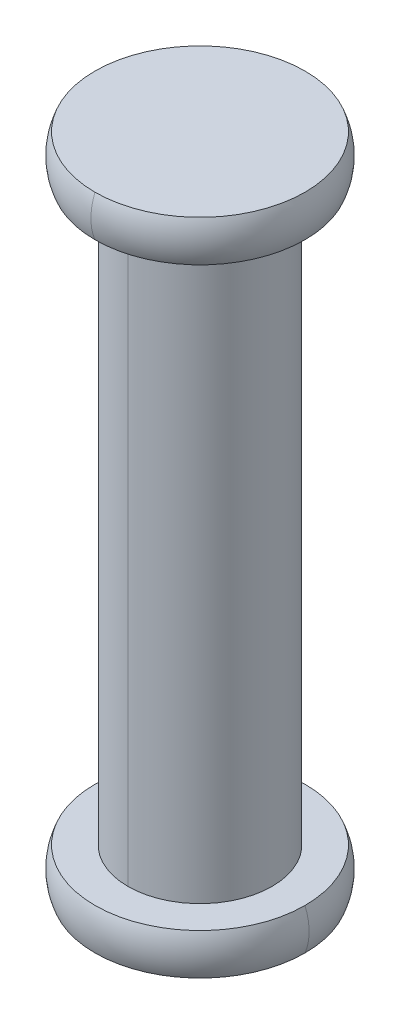
ISO-10303-21;
HEADER;
FILE_DESCRIPTION(('STEP AP214'),'2;1');
FILE_NAME('part.step','',(''),(''),'','','');
FILE_SCHEMA(('AUTOMOTIVE_DESIGN { 1 0 10303 214 1 1 1 1 }'));
ENDSEC;
DATA;
#1=APPLICATION_CONTEXT('core data for automotive mechanical design processes');
#2=APPLICATION_PROTOCOL_DEFINITION('international standard','automotive_design',2000,#1);
#3=PRODUCT_CONTEXT('',#1,'mechanical');
#4=PRODUCT('Part','Part','',(#3));
#5=PRODUCT_RELATED_PRODUCT_CATEGORY('part','',(#4));
#6=PRODUCT_DEFINITION_FORMATION('','',#4);
#7=PRODUCT_DEFINITION_CONTEXT('part definition',#1,'design');
#8=PRODUCT_DEFINITION('design','',#6,#7);
#9=PRODUCT_DEFINITION_SHAPE('','',#8);
#10=(LENGTH_UNIT() NAMED_UNIT(*) SI_UNIT(.MILLI.,.METRE.));
#11=(NAMED_UNIT(*) PLANE_ANGLE_UNIT() SI_UNIT($,.RADIAN.));
#12=(NAMED_UNIT(*) SI_UNIT($,.STERADIAN.) SOLID_ANGLE_UNIT());
#13=UNCERTAINTY_MEASURE_WITH_UNIT(LENGTH_MEASURE(1.E-05),#10,'distance_accuracy_value','');
#14=(GEOMETRIC_REPRESENTATION_CONTEXT(3) GLOBAL_UNCERTAINTY_ASSIGNED_CONTEXT((#13)) GLOBAL_UNIT_ASSIGNED_CONTEXT((#10,
#11,#12)) REPRESENTATION_CONTEXT('',''));
#15=CARTESIAN_POINT('',(0.,0.,0.));
#16=DIRECTION('',(0.,0.,1.));
#17=DIRECTION('',(1.,0.,0.));
#18=AXIS2_PLACEMENT_3D('',#15,#16,#17);
#19=CARTESIAN_POINT('',(29.1000000000009,-15.8473895582304,-32.0000000000058));
#20=DIRECTION('',(0.,1.,0.));
#21=DIRECTION('',(1.,0.,0.));
#22=AXIS2_PLACEMENT_3D('',#19,#20,#21);
#23=PLANE('',#22);
#24=CARTESIAN_POINT('',(24.0000000000009,-15.8473895582304,-32.0000000000058));
#25=DIRECTION('',(0.,1.,0.));
#26=DIRECTION('',(-1.,0.,0.));
#27=AXIS2_PLACEMENT_3D('',#24,#25,#26);
#28=CIRCLE('',#27,5.1);
#29=CARTESIAN_POINT('',(18.9000000000009,-15.8473895582304,-32.0000000000058));
#30=VERTEX_POINT('',#29);
#31=CARTESIAN_POINT('',(29.1000000000009,-15.8473895582304,-32.0000000000058));
#32=VERTEX_POINT('',#31);
#33=EDGE_CURVE('E163',#30,#32,#28,.T.);
#34=ORIENTED_EDGE('',*,*,#33,.F.);
#35=CARTESIAN_POINT('',(24.0000000000009,-15.8473895582304,-32.0000000000058));
#36=DIRECTION('',(0.,1.,0.));
#37=DIRECTION('',(-1.,0.,0.));
#38=AXIS2_PLACEMENT_3D('',#35,#36,#37);
#39=CIRCLE('',#38,5.1);
#40=EDGE_CURVE('E11',#32,#30,#39,.T.);
#41=ORIENTED_EDGE('',*,*,#40,.F.);
#42=EDGE_LOOP('',(#34,#41));
#43=FACE_BOUND('',#42,.T.);
#44=ADVANCED_FACE('F16',(#43),#23,.F.);
#45=CARTESIAN_POINT('',(29.1000000000009,16.1526104417696,-32.0000000000058));
#46=DIRECTION('',(0.,-1.,0.));
#47=DIRECTION('',(0.,0.,-1.));
#48=AXIS2_PLACEMENT_3D('',#45,#46,#47);
#49=PLANE('',#48);
#50=CARTESIAN_POINT('',(24.0000000000009,16.1526104417696,-32.0000000000058));
#51=DIRECTION('',(0.,-1.,0.));
#52=DIRECTION('',(0.,0.,1.));
#53=AXIS2_PLACEMENT_3D('',#50,#51,#52);
#54=CIRCLE('',#53,5.1);
#55=CARTESIAN_POINT('',(24.0000000000009,16.1526104417696,-26.9000000000058));
#56=VERTEX_POINT('',#55);
#57=CARTESIAN_POINT('',(24.0000000000009,16.1526104417696,-37.1000000000058));
#58=VERTEX_POINT('',#57);
#59=EDGE_CURVE('E25',#56,#58,#54,.T.);
#60=ORIENTED_EDGE('',*,*,#59,.F.);
#61=CARTESIAN_POINT('',(24.0000000000009,16.1526104417696,-32.0000000000058));
#62=DIRECTION('',(0.,-1.,0.));
#63=DIRECTION('',(0.,0.,1.));
#64=AXIS2_PLACEMENT_3D('',#61,#62,#63);
#65=CIRCLE('',#64,5.1);
#66=EDGE_CURVE('E139',#58,#56,#65,.T.);
#67=ORIENTED_EDGE('',*,*,#66,.F.);
#68=EDGE_LOOP('',(#60,#67));
#69=FACE_BOUND('',#68,.T.);
#70=ADVANCED_FACE('F302',(#69),#49,.F.);
#71=CARTESIAN_POINT('',(24.0000000000009,-14.8473895582304,-32.0000000000058));
#72=DIRECTION('',(0.,1.,0.));
#73=DIRECTION('',(-1.,0.,0.));
#74=AXIS2_PLACEMENT_3D('',#71,#72,#73);
#75=TOROIDAL_SURFACE('',#74,2.7,2.6);
#76=CARTESIAN_POINT('',(26.700000000001,-14.8473895582304,-32.0000000000058));
#77=DIRECTION('',(0.,0.,1.));
#78=DIRECTION('',(1.,0.,0.));
#79=AXIS2_PLACEMENT_3D('',#76,#77,#78);
#80=CIRCLE('',#79,2.6);
#81=CARTESIAN_POINT('',(29.1000000000009,-13.8473895582304,-32.0000000000058));
#82=VERTEX_POINT('',#81);
#83=EDGE_CURVE('E150',#32,#82,#80,.T.);
#84=ORIENTED_EDGE('',*,*,#83,.F.);
#85=ORIENTED_EDGE('',*,*,#40,.T.);
#86=CARTESIAN_POINT('',(21.3000000000009,-14.8473895582304,-32.0000000000058));
#87=DIRECTION('',(0.,0.,-1.));
#88=DIRECTION('',(0.,1.,0.));
#89=AXIS2_PLACEMENT_3D('',#86,#87,#88);
#90=CIRCLE('',#89,2.6);
#91=CARTESIAN_POINT('',(18.9000000000009,-13.8473895582304,-32.0000000000058));
#92=VERTEX_POINT('',#91);
#93=EDGE_CURVE('E117',#30,#92,#90,.T.);
#94=ORIENTED_EDGE('',*,*,#93,.T.);
#95=CARTESIAN_POINT('',(24.0000000000009,-13.8473895582304,-32.0000000000058));
#96=DIRECTION('',(0.,-1.,0.));
#97=DIRECTION('',(-1.,0.,0.));
#98=AXIS2_PLACEMENT_3D('',#95,#96,#97);
#99=CIRCLE('',#98,5.1);
#100=EDGE_CURVE('E38',#92,#82,#99,.T.);
#101=ORIENTED_EDGE('',*,*,#100,.T.);
#102=EDGE_LOOP('',(#84,#85,#94,#101));
#103=FACE_BOUND('',#102,.T.);
#104=ADVANCED_FACE('F285',(#103),#75,.T.);
#105=CARTESIAN_POINT('',(24.0000000000009,15.1526104417696,-32.0000000000058));
#106=DIRECTION('',(0.,1.,0.));
#107=DIRECTION('',(0.,0.,1.));
#108=AXIS2_PLACEMENT_3D('',#105,#106,#107);
#109=TOROIDAL_SURFACE('',#108,2.7,2.6);
#110=CARTESIAN_POINT('',(24.0000000000009,15.1526104417696,-34.7000000000058));
#111=DIRECTION('',(1.,0.,0.));
#112=DIRECTION('',(0.,0.,-1.));
#113=AXIS2_PLACEMENT_3D('',#110,#111,#112);
#114=CIRCLE('',#113,2.6);
#115=CARTESIAN_POINT('',(24.0000000000009,14.1526104417696,-37.1000000000058));
#116=VERTEX_POINT('',#115);
#117=EDGE_CURVE('E135',#116,#58,#114,.T.);
#118=ORIENTED_EDGE('',*,*,#117,.F.);
#119=CARTESIAN_POINT('',(24.0000000000009,14.1526104417696,-32.0000000000058));
#120=DIRECTION('',(0.,1.,0.));
#121=DIRECTION('',(0.,0.,1.));
#122=AXIS2_PLACEMENT_3D('',#119,#120,#121);
#123=CIRCLE('',#122,5.1);
#124=CARTESIAN_POINT('',(24.0000000000009,14.1526104417696,-26.9000000000058));
#125=VERTEX_POINT('',#124);
#126=EDGE_CURVE('E90',#116,#125,#123,.T.);
#127=ORIENTED_EDGE('',*,*,#126,.T.);
#128=CARTESIAN_POINT('',(24.0000000000009,15.1526104417696,-29.3000000000058));
#129=DIRECTION('',(-1.,0.,0.));
#130=DIRECTION('',(0.,0.,1.));
#131=AXIS2_PLACEMENT_3D('',#128,#129,#130);
#132=CIRCLE('',#131,2.6);
#133=EDGE_CURVE('E159',#125,#56,#132,.T.);
#134=ORIENTED_EDGE('',*,*,#133,.T.);
#135=ORIENTED_EDGE('',*,*,#59,.T.);
#136=EDGE_LOOP('',(#118,#127,#134,#135));
#137=FACE_BOUND('',#136,.T.);
#138=ADVANCED_FACE('F281',(#137),#109,.T.);
#139=CARTESIAN_POINT('',(27.5000000000009,-13.8473895582304,-32.0000000000058));
#140=DIRECTION('',(0.,-1.,0.));
#141=DIRECTION('',(0.,0.,-1.));
#142=AXIS2_PLACEMENT_3D('',#139,#140,#141);
#143=PLANE('',#142);
#144=CARTESIAN_POINT('',(24.0000000000009,-13.8473895582304,-32.0000000000058));
#145=DIRECTION('',(0.,1.,0.));
#146=DIRECTION('',(0.,0.,1.));
#147=AXIS2_PLACEMENT_3D('',#144,#145,#146);
#148=CIRCLE('',#147,3.5);
#149=CARTESIAN_POINT('',(24.0000000000009,-13.8473895582304,-28.5000000000058));
#150=VERTEX_POINT('',#149);
#151=CARTESIAN_POINT('',(24.0000000000009,-13.8473895582304,-35.5000000000058));
#152=VERTEX_POINT('',#151);
#153=EDGE_CURVE('E115',#150,#152,#148,.T.);
#154=ORIENTED_EDGE('',*,*,#153,.F.);
#155=CARTESIAN_POINT('',(24.0000000000009,-13.8473895582304,-32.0000000000058));
#156=DIRECTION('',(0.,1.,0.));
#157=DIRECTION('',(0.,0.,1.));
#158=AXIS2_PLACEMENT_3D('',#155,#156,#157);
#159=CIRCLE('',#158,3.5);
#160=EDGE_CURVE('E107',#152,#150,#159,.T.);
#161=ORIENTED_EDGE('',*,*,#160,.F.);
#162=EDGE_LOOP('',(#154,#161));
#163=FACE_BOUND('',#162,.T.);
#164=ORIENTED_EDGE('',*,*,#100,.F.);
#165=CARTESIAN_POINT('',(24.0000000000009,-13.8473895582304,-32.0000000000058));
#166=DIRECTION('',(0.,-1.,0.));
#167=DIRECTION('',(-1.,0.,0.));
#168=AXIS2_PLACEMENT_3D('',#165,#166,#167);
#169=CIRCLE('',#168,5.1);
#170=EDGE_CURVE('E145',#82,#92,#169,.T.);
#171=ORIENTED_EDGE('',*,*,#170,.F.);
#172=EDGE_LOOP('',(#164,#171));
#173=FACE_BOUND('',#172,.T.);
#174=ADVANCED_FACE('F113',(#163,#173),#143,.F.);
#175=CARTESIAN_POINT('',(27.5000000000009,14.1526104417696,-32.0000000000058));
#176=DIRECTION('',(0.,1.,0.));
#177=DIRECTION('',(1.,0.,0.));
#178=AXIS2_PLACEMENT_3D('',#175,#176,#177);
#179=PLANE('',#178);
#180=CARTESIAN_POINT('',(24.0000000000009,14.1526104417696,-32.0000000000058));
#181=DIRECTION('',(0.,-1.,0.));
#182=DIRECTION('',(0.,0.,1.));
#183=AXIS2_PLACEMENT_3D('',#180,#181,#182);
#184=CIRCLE('',#183,3.5);
#185=CARTESIAN_POINT('',(24.0000000000009,14.1526104417696,-28.5000000000058));
#186=VERTEX_POINT('',#185);
#187=CARTESIAN_POINT('',(24.0000000000009,14.1526104417696,-35.5000000000058));
#188=VERTEX_POINT('',#187);
#189=EDGE_CURVE('E82',#186,#188,#184,.T.);
#190=ORIENTED_EDGE('',*,*,#189,.F.);
#191=CARTESIAN_POINT('',(24.0000000000009,14.1526104417696,-32.0000000000058));
#192=DIRECTION('',(0.,-1.,0.));
#193=DIRECTION('',(0.,0.,1.));
#194=AXIS2_PLACEMENT_3D('',#191,#192,#193);
#195=CIRCLE('',#194,3.5);
#196=EDGE_CURVE('E125',#188,#186,#195,.T.);
#197=ORIENTED_EDGE('',*,*,#196,.F.);
#198=EDGE_LOOP('',(#190,#197));
#199=FACE_BOUND('',#198,.T.);
#200=CARTESIAN_POINT('',(24.0000000000009,14.1526104417696,-32.0000000000058));
#201=DIRECTION('',(0.,1.,0.));
#202=DIRECTION('',(0.,0.,1.));
#203=AXIS2_PLACEMENT_3D('',#200,#201,#202);
#204=CIRCLE('',#203,5.1);
#205=EDGE_CURVE('E140',#125,#116,#204,.T.);
#206=ORIENTED_EDGE('',*,*,#205,.F.);
#207=ORIENTED_EDGE('',*,*,#126,.F.);
#208=EDGE_LOOP('',(#206,#207));
#209=FACE_BOUND('',#208,.T.);
#210=ADVANCED_FACE('F295',(#199,#209),#179,.F.);
#211=CARTESIAN_POINT('',(24.0000000000009,16.1526104417696,-32.0000000000058));
#212=DIRECTION('',(0.,1.,0.));
#213=DIRECTION('',(0.,0.,1.));
#214=AXIS2_PLACEMENT_3D('',#211,#212,#213);
#215=CYLINDRICAL_SURFACE('',#214,3.5);
#216=DIRECTION('',(0.,1.,0.));
#217=VECTOR('',#216,1.);
#218=CARTESIAN_POINT('',(24.0000000000009,16.1526104417696,-35.5000000000058));
#219=LINE('',#218,#217);
#220=EDGE_CURVE('E120',#152,#188,#219,.T.);
#221=ORIENTED_EDGE('',*,*,#220,.F.);
#222=ORIENTED_EDGE('',*,*,#160,.T.);
#223=DIRECTION('',(0.,1.,0.));
#224=VECTOR('',#223,1.);
#225=CARTESIAN_POINT('',(24.0000000000009,16.1526104417696,-28.5000000000058));
#226=LINE('',#225,#224);
#227=EDGE_CURVE('E128',#150,#186,#226,.T.);
#228=ORIENTED_EDGE('',*,*,#227,.T.);
#229=ORIENTED_EDGE('',*,*,#189,.T.);
#230=EDGE_LOOP('',(#221,#222,#228,#229));
#231=FACE_BOUND('',#230,.T.);
#232=ADVANCED_FACE('F121',(#231),#215,.T.);
#233=CARTESIAN_POINT('',(24.0000000000009,-14.8473895582304,-32.0000000000058));
#234=DIRECTION('',(0.,1.,0.));
#235=DIRECTION('',(-1.,0.,0.));
#236=AXIS2_PLACEMENT_3D('',#233,#234,#235);
#237=TOROIDAL_SURFACE('',#236,2.7,2.6);
#238=ORIENTED_EDGE('',*,*,#33,.T.);
#239=ORIENTED_EDGE('',*,*,#83,.T.);
#240=ORIENTED_EDGE('',*,*,#170,.T.);
#241=ORIENTED_EDGE('',*,*,#93,.F.);
#242=EDGE_LOOP('',(#238,#239,#240,#241));
#243=FACE_BOUND('',#242,.T.);
#244=ADVANCED_FACE('F263',(#243),#237,.T.);
#245=CARTESIAN_POINT('',(24.0000000000009,15.1526104417696,-32.0000000000058));
#246=DIRECTION('',(0.,1.,0.));
#247=DIRECTION('',(0.,0.,1.));
#248=AXIS2_PLACEMENT_3D('',#245,#246,#247);
#249=TOROIDAL_SURFACE('',#248,2.7,2.6);
#250=ORIENTED_EDGE('',*,*,#205,.T.);
#251=ORIENTED_EDGE('',*,*,#117,.T.);
#252=ORIENTED_EDGE('',*,*,#66,.T.);
#253=ORIENTED_EDGE('',*,*,#133,.F.);
#254=EDGE_LOOP('',(#250,#251,#252,#253));
#255=FACE_BOUND('',#254,.T.);
#256=ADVANCED_FACE('F252',(#255),#249,.T.);
#257=CARTESIAN_POINT('',(24.0000000000009,16.1526104417696,-32.0000000000058));
#258=DIRECTION('',(0.,1.,0.));
#259=DIRECTION('',(0.,0.,1.));
#260=AXIS2_PLACEMENT_3D('',#257,#258,#259);
#261=CYLINDRICAL_SURFACE('',#260,3.5);
#262=ORIENTED_EDGE('',*,*,#153,.T.);
#263=ORIENTED_EDGE('',*,*,#220,.T.);
#264=ORIENTED_EDGE('',*,*,#196,.T.);
#265=ORIENTED_EDGE('',*,*,#227,.F.);
#266=EDGE_LOOP('',(#262,#263,#264,#265));
#267=FACE_BOUND('',#266,.T.);
#268=ADVANCED_FACE('F127',(#267),#261,.T.);
#269=CLOSED_SHELL('',(#44,#70,#104,#138,#174,#210,#232,#244,#256,#268));
#270=MANIFOLD_SOLID_BREP('B1',#269);
#271=ADVANCED_BREP_SHAPE_REPRESENTATION('',(#18,#270),#14);
#272=SHAPE_DEFINITION_REPRESENTATION(#9,#271);
ENDSEC;
END-ISO-10303-21;
